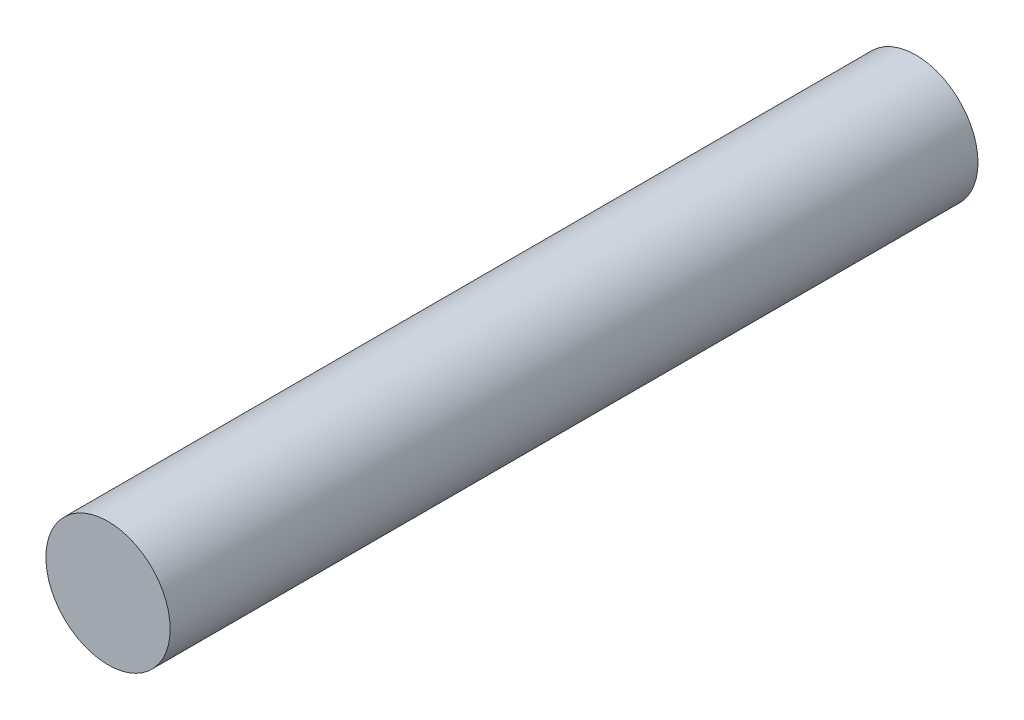
ISO-10303-21;
HEADER;
FILE_DESCRIPTION(('STEP AP214'),'2;1');
FILE_NAME('part.step','',(''),(''),'','','');
FILE_SCHEMA(('AUTOMOTIVE_DESIGN { 1 0 10303 214 1 1 1 1 }'));
ENDSEC;
DATA;
#1=APPLICATION_CONTEXT('core data for automotive mechanical design processes');
#2=APPLICATION_PROTOCOL_DEFINITION('international standard','automotive_design',2000,#1);
#3=PRODUCT_CONTEXT('',#1,'mechanical');
#4=PRODUCT('Part','Part','',(#3));
#5=PRODUCT_RELATED_PRODUCT_CATEGORY('part','',(#4));
#6=PRODUCT_DEFINITION_FORMATION('','',#4);
#7=PRODUCT_DEFINITION_CONTEXT('part definition',#1,'design');
#8=PRODUCT_DEFINITION('design','',#6,#7);
#9=PRODUCT_DEFINITION_SHAPE('','',#8);
#10=(LENGTH_UNIT() NAMED_UNIT(*) SI_UNIT(.MILLI.,.METRE.));
#11=(NAMED_UNIT(*) PLANE_ANGLE_UNIT() SI_UNIT($,.RADIAN.));
#12=(NAMED_UNIT(*) SI_UNIT($,.STERADIAN.) SOLID_ANGLE_UNIT());
#13=UNCERTAINTY_MEASURE_WITH_UNIT(LENGTH_MEASURE(1.E-05),#10,'distance_accuracy_value','');
#14=(GEOMETRIC_REPRESENTATION_CONTEXT(3) GLOBAL_UNCERTAINTY_ASSIGNED_CONTEXT((#13)) GLOBAL_UNIT_ASSIGNED_CONTEXT((#10,
#11,#12)) REPRESENTATION_CONTEXT('',''));
#15=CARTESIAN_POINT('',(0.,0.,0.));
#16=DIRECTION('',(0.,0.,1.));
#17=DIRECTION('',(1.,0.,0.));
#18=AXIS2_PLACEMENT_3D('',#15,#16,#17);
#19=CARTESIAN_POINT('',(0.,0.,39.));
#20=DIRECTION('',(0.,0.,-1.));
#21=DIRECTION('',(-1.,0.,0.));
#22=AXIS2_PLACEMENT_3D('',#19,#20,#21);
#23=CYLINDRICAL_SURFACE('',#22,3.);
#24=CARTESIAN_POINT('',(0.,0.,39.));
#25=DIRECTION('',(0.,0.,1.));
#26=DIRECTION('',(1.,0.,0.));
#27=AXIS2_PLACEMENT_3D('',#24,#25,#26);
#28=CIRCLE('',#27,3.);
#29=CARTESIAN_POINT('',(3.,0.,39.));
#30=VERTEX_POINT('',#29);
#31=EDGE_CURVE('E10',#30,#30,#28,.T.);
#32=ORIENTED_EDGE('',*,*,#31,.F.);
#33=EDGE_LOOP('',(#32));
#34=FACE_BOUND('',#33,.T.);
#35=CARTESIAN_POINT('',(0.,0.,0.));
#36=DIRECTION('',(0.,0.,1.));
#37=DIRECTION('',(1.,0.,0.));
#38=AXIS2_PLACEMENT_3D('',#35,#36,#37);
#39=CIRCLE('',#38,3.);
#40=CARTESIAN_POINT('',(3.,0.,0.));
#41=VERTEX_POINT('',#40);
#42=EDGE_CURVE('E44',#41,#41,#39,.T.);
#43=ORIENTED_EDGE('',*,*,#42,.T.);
#44=EDGE_LOOP('',(#43));
#45=FACE_BOUND('',#44,.T.);
#46=ADVANCED_FACE('F41',(#34,#45),#23,.T.);
#47=CARTESIAN_POINT('',(0.,0.,39.));
#48=DIRECTION('',(0.,0.,1.));
#49=DIRECTION('',(1.,0.,0.));
#50=AXIS2_PLACEMENT_3D('',#47,#48,#49);
#51=PLANE('',#50);
#52=ORIENTED_EDGE('',*,*,#31,.T.);
#53=EDGE_LOOP('',(#52));
#54=FACE_BOUND('',#53,.T.);
#55=ADVANCED_FACE('F58',(#54),#51,.T.);
#56=CARTESIAN_POINT('',(0.,0.,0.));
#57=DIRECTION('',(0.,0.,1.));
#58=DIRECTION('',(1.,0.,0.));
#59=AXIS2_PLACEMENT_3D('',#56,#57,#58);
#60=PLANE('',#59);
#61=ORIENTED_EDGE('',*,*,#42,.F.);
#62=EDGE_LOOP('',(#61));
#63=FACE_BOUND('',#62,.T.);
#64=ADVANCED_FACE('F56',(#63),#60,.F.);
#65=CLOSED_SHELL('',(#46,#55,#64));
#66=MANIFOLD_SOLID_BREP('B2',#65);
#67=ADVANCED_BREP_SHAPE_REPRESENTATION('',(#18,#66),#14);
#68=SHAPE_DEFINITION_REPRESENTATION(#9,#67);
ENDSEC;
END-ISO-10303-21;
